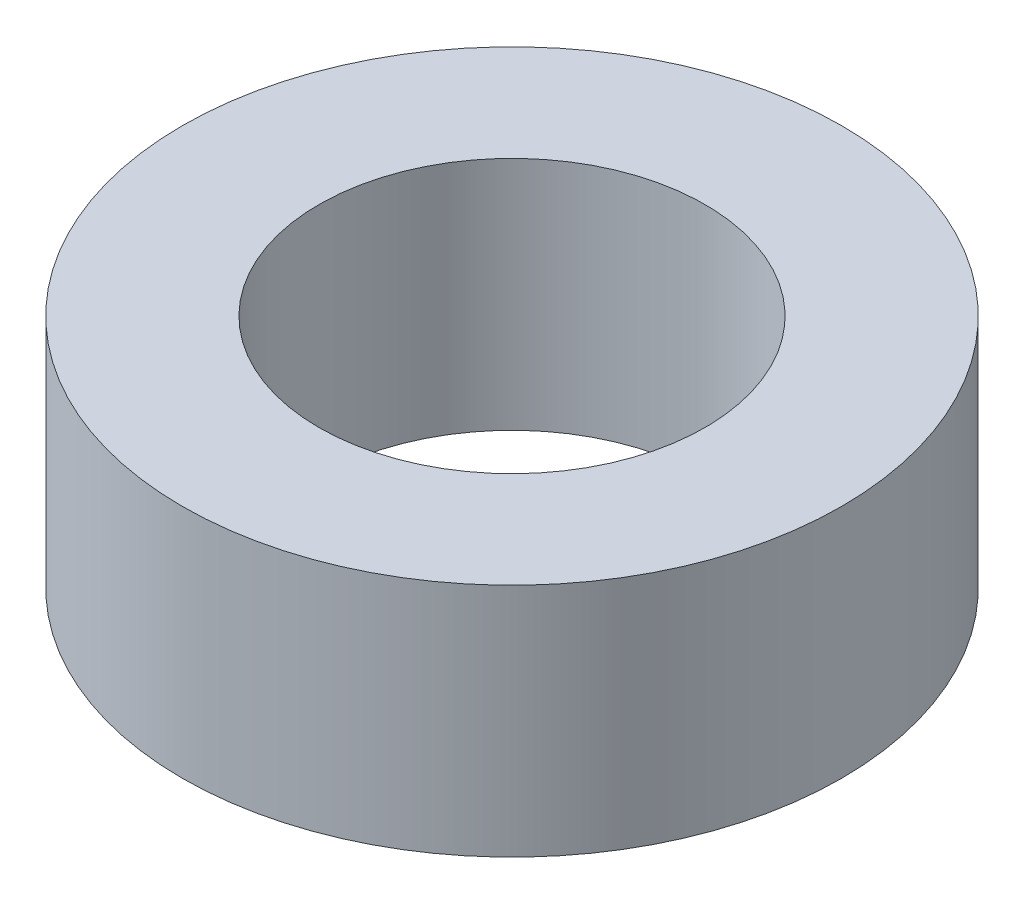
ISO-10303-21;
HEADER;
FILE_DESCRIPTION(('STEP AP214'),'2;1');
FILE_NAME('part.step','',(''),(''),'','','');
FILE_SCHEMA(('AUTOMOTIVE_DESIGN { 1 0 10303 214 1 1 1 1 }'));
ENDSEC;
DATA;
#1=APPLICATION_CONTEXT('core data for automotive mechanical design processes');
#2=APPLICATION_PROTOCOL_DEFINITION('international standard','automotive_design',2000,#1);
#3=PRODUCT_CONTEXT('',#1,'mechanical');
#4=PRODUCT('Part','Part','',(#3));
#5=PRODUCT_RELATED_PRODUCT_CATEGORY('part','',(#4));
#6=PRODUCT_DEFINITION_FORMATION('','',#4);
#7=PRODUCT_DEFINITION_CONTEXT('part definition',#1,'design');
#8=PRODUCT_DEFINITION('design','',#6,#7);
#9=PRODUCT_DEFINITION_SHAPE('','',#8);
#10=(LENGTH_UNIT() NAMED_UNIT(*) SI_UNIT(.MILLI.,.METRE.));
#11=(NAMED_UNIT(*) PLANE_ANGLE_UNIT() SI_UNIT($,.RADIAN.));
#12=(NAMED_UNIT(*) SI_UNIT($,.STERADIAN.) SOLID_ANGLE_UNIT());
#13=UNCERTAINTY_MEASURE_WITH_UNIT(LENGTH_MEASURE(1.E-05),#10,'distance_accuracy_value','');
#14=(GEOMETRIC_REPRESENTATION_CONTEXT(3) GLOBAL_UNCERTAINTY_ASSIGNED_CONTEXT((#13)) GLOBAL_UNIT_ASSIGNED_CONTEXT((#10,
#11,#12)) REPRESENTATION_CONTEXT('',''));
#15=CARTESIAN_POINT('',(0.,0.,0.));
#16=DIRECTION('',(0.,0.,1.));
#17=DIRECTION('',(1.,0.,0.));
#18=AXIS2_PLACEMENT_3D('',#15,#16,#17);
#19=CARTESIAN_POINT('',(0.,5.,0.));
#20=DIRECTION('',(0.,1.,0.));
#21=DIRECTION('',(0.,0.,1.));
#22=AXIS2_PLACEMENT_3D('',#19,#20,#21);
#23=PLANE('',#22);
#24=CARTESIAN_POINT('',(0.,5.,0.));
#25=DIRECTION('',(0.,1.,0.));
#26=DIRECTION('',(0.,0.,1.));
#27=AXIS2_PLACEMENT_3D('',#24,#25,#26);
#28=CIRCLE('',#27,7.);
#29=CARTESIAN_POINT('',(0.,5.,7.));
#30=VERTEX_POINT('',#29);
#31=EDGE_CURVE('E10',#30,#30,#28,.T.);
#32=ORIENTED_EDGE('',*,*,#31,.T.);
#33=EDGE_LOOP('',(#32));
#34=FACE_BOUND('',#33,.T.);
#35=CARTESIAN_POINT('',(0.,5.,0.));
#36=DIRECTION('',(0.,1.,0.));
#37=DIRECTION('',(0.,0.,1.));
#38=AXIS2_PLACEMENT_3D('',#35,#36,#37);
#39=CIRCLE('',#38,4.1);
#40=CARTESIAN_POINT('',(0.,5.,4.1));
#41=VERTEX_POINT('',#40);
#42=EDGE_CURVE('E42',#41,#41,#39,.T.);
#43=ORIENTED_EDGE('',*,*,#42,.F.);
#44=EDGE_LOOP('',(#43));
#45=FACE_BOUND('',#44,.T.);
#46=ADVANCED_FACE('F31',(#34,#45),#23,.T.);
#47=CARTESIAN_POINT('',(0.,0.,0.));
#48=DIRECTION('',(0.,1.,0.));
#49=DIRECTION('',(0.,0.,1.));
#50=AXIS2_PLACEMENT_3D('',#47,#48,#49);
#51=PLANE('',#50);
#52=CARTESIAN_POINT('',(0.,0.,0.));
#53=DIRECTION('',(0.,1.,0.));
#54=DIRECTION('',(0.,0.,1.));
#55=AXIS2_PLACEMENT_3D('',#52,#53,#54);
#56=CIRCLE('',#55,7.);
#57=CARTESIAN_POINT('',(0.,0.,7.));
#58=VERTEX_POINT('',#57);
#59=EDGE_CURVE('E35',#58,#58,#56,.T.);
#60=ORIENTED_EDGE('',*,*,#59,.F.);
#61=EDGE_LOOP('',(#60));
#62=FACE_BOUND('',#61,.T.);
#63=CARTESIAN_POINT('',(0.,0.,0.));
#64=DIRECTION('',(0.,1.,0.));
#65=DIRECTION('',(0.,0.,1.));
#66=AXIS2_PLACEMENT_3D('',#63,#64,#65);
#67=CIRCLE('',#66,4.1);
#68=CARTESIAN_POINT('',(0.,0.,4.1));
#69=VERTEX_POINT('',#68);
#70=EDGE_CURVE('E44',#69,#69,#67,.T.);
#71=ORIENTED_EDGE('',*,*,#70,.T.);
#72=EDGE_LOOP('',(#71));
#73=FACE_BOUND('',#72,.T.);
#74=ADVANCED_FACE('F54',(#62,#73),#51,.F.);
#75=CARTESIAN_POINT('',(0.,5.,0.));
#76=DIRECTION('',(0.,-1.,0.));
#77=DIRECTION('',(0.,0.,-1.));
#78=AXIS2_PLACEMENT_3D('',#75,#76,#77);
#79=CYLINDRICAL_SURFACE('',#78,7.);
#80=ORIENTED_EDGE('',*,*,#31,.F.);
#81=EDGE_LOOP('',(#80));
#82=FACE_BOUND('',#81,.T.);
#83=ORIENTED_EDGE('',*,*,#59,.T.);
#84=EDGE_LOOP('',(#83));
#85=FACE_BOUND('',#84,.T.);
#86=ADVANCED_FACE('F33',(#82,#85),#79,.T.);
#87=CARTESIAN_POINT('',(0.,5.,0.));
#88=DIRECTION('',(0.,-1.,0.));
#89=DIRECTION('',(0.,0.,-1.));
#90=AXIS2_PLACEMENT_3D('',#87,#88,#89);
#91=CYLINDRICAL_SURFACE('',#90,4.1);
#92=ORIENTED_EDGE('',*,*,#42,.T.);
#93=EDGE_LOOP('',(#92));
#94=FACE_BOUND('',#93,.T.);
#95=ORIENTED_EDGE('',*,*,#70,.F.);
#96=EDGE_LOOP('',(#95));
#97=FACE_BOUND('',#96,.T.);
#98=ADVANCED_FACE('F50',(#94,#97),#91,.F.);
#99=CLOSED_SHELL('',(#46,#74,#86,#98));
#100=MANIFOLD_SOLID_BREP('B2',#99);
#101=ADVANCED_BREP_SHAPE_REPRESENTATION('',(#18,#100),#14);
#102=SHAPE_DEFINITION_REPRESENTATION(#9,#101);
ENDSEC;
END-ISO-10303-21;
